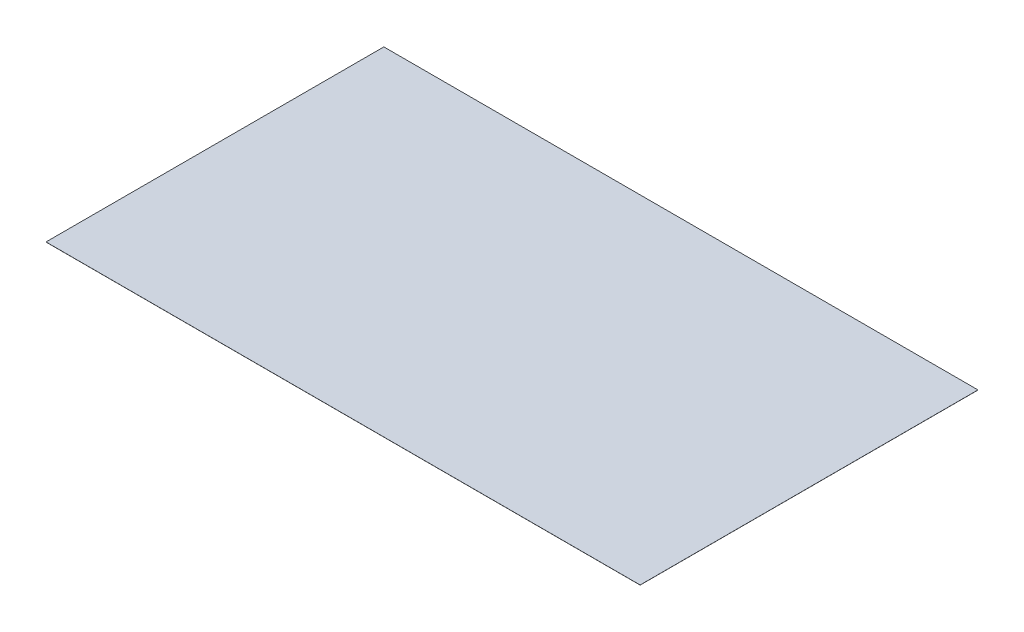
ISO-10303-21;
HEADER;
FILE_DESCRIPTION(('STEP AP214'),'2;1');
FILE_NAME('part.step','',(''),(''),'','','');
FILE_SCHEMA(('AUTOMOTIVE_DESIGN { 1 0 10303 214 1 1 1 1 }'));
ENDSEC;
DATA;
#1=APPLICATION_CONTEXT('core data for automotive mechanical design processes');
#2=APPLICATION_PROTOCOL_DEFINITION('international standard','automotive_design',2000,#1);
#3=PRODUCT_CONTEXT('',#1,'mechanical');
#4=PRODUCT('Part','Part','',(#3));
#5=PRODUCT_RELATED_PRODUCT_CATEGORY('part','',(#4));
#6=PRODUCT_DEFINITION_FORMATION('','',#4);
#7=PRODUCT_DEFINITION_CONTEXT('part definition',#1,'design');
#8=PRODUCT_DEFINITION('design','',#6,#7);
#9=PRODUCT_DEFINITION_SHAPE('','',#8);
#10=(LENGTH_UNIT() NAMED_UNIT(*) SI_UNIT(.MILLI.,.METRE.));
#11=(NAMED_UNIT(*) PLANE_ANGLE_UNIT() SI_UNIT($,.RADIAN.));
#12=(NAMED_UNIT(*) SI_UNIT($,.STERADIAN.) SOLID_ANGLE_UNIT());
#13=UNCERTAINTY_MEASURE_WITH_UNIT(LENGTH_MEASURE(1.E-05),#10,'distance_accuracy_value','');
#14=(GEOMETRIC_REPRESENTATION_CONTEXT(3) GLOBAL_UNCERTAINTY_ASSIGNED_CONTEXT((#13)) GLOBAL_UNIT_ASSIGNED_CONTEXT((#10,
#11,#12)) REPRESENTATION_CONTEXT('',''));
#15=CARTESIAN_POINT('',(0.,0.,0.));
#16=DIRECTION('',(0.,0.,1.));
#17=DIRECTION('',(1.,0.,0.));
#18=AXIS2_PLACEMENT_3D('',#15,#16,#17);
#19=CARTESIAN_POINT('',(0.,1.,0.));
#20=DIRECTION('',(-1.,0.,0.));
#21=DIRECTION('',(0.,0.,1.));
#22=AXIS2_PLACEMENT_3D('',#19,#20,#21);
#23=PLANE('',#22);
#24=DIRECTION('',(0.,0.,-1.));
#25=VECTOR('',#24,1.);
#26=CARTESIAN_POINT('',(0.,0.,0.));
#27=LINE('',#26,#25);
#28=CARTESIAN_POINT('',(3.55147571752732E-13,0.,2900.));
#29=VERTEX_POINT('',#28);
#30=CARTESIAN_POINT('',(0.,0.,0.));
#31=VERTEX_POINT('',#30);
#32=EDGE_CURVE('E98',#29,#31,#27,.T.);
#33=ORIENTED_EDGE('',*,*,#32,.T.);
#34=DIRECTION('',(0.,-1.,0.));
#35=VECTOR('',#34,1.);
#36=CARTESIAN_POINT('',(0.,1.,0.));
#37=LINE('',#36,#35);
#38=CARTESIAN_POINT('',(0.,1.,0.));
#39=VERTEX_POINT('',#38);
#40=EDGE_CURVE('E11',#39,#31,#37,.T.);
#41=ORIENTED_EDGE('',*,*,#40,.F.);
#42=DIRECTION('',(0.,0.,-1.));
#43=VECTOR('',#42,1.);
#44=CARTESIAN_POINT('',(0.,1.,0.));
#45=LINE('',#44,#43);
#46=CARTESIAN_POINT('',(3.55147571752732E-13,1.,2900.));
#47=VERTEX_POINT('',#46);
#48=EDGE_CURVE('E86',#47,#39,#45,.T.);
#49=ORIENTED_EDGE('',*,*,#48,.F.);
#50=DIRECTION('',(0.,-1.,0.));
#51=VECTOR('',#50,1.);
#52=CARTESIAN_POINT('',(3.55147571752732E-13,1.,2900.));
#53=LINE('',#52,#51);
#54=EDGE_CURVE('E94',#47,#29,#53,.T.);
#55=ORIENTED_EDGE('',*,*,#54,.T.);
#56=EDGE_LOOP('',(#33,#41,#49,#55));
#57=FACE_BOUND('',#56,.T.);
#58=ADVANCED_FACE('F35',(#57),#23,.F.);
#59=CARTESIAN_POINT('',(0.,1.,0.));
#60=DIRECTION('',(0.,0.,1.));
#61=DIRECTION('',(1.,0.,0.));
#62=AXIS2_PLACEMENT_3D('',#59,#60,#61);
#63=PLANE('',#62);
#64=DIRECTION('',(-1.,0.,0.));
#65=VECTOR('',#64,1.);
#66=CARTESIAN_POINT('',(0.,0.,0.));
#67=LINE('',#66,#65);
#68=CARTESIAN_POINT('',(-5100.,0.,6.2456986756515E-13));
#69=VERTEX_POINT('',#68);
#70=EDGE_CURVE('E90',#31,#69,#67,.T.);
#71=ORIENTED_EDGE('',*,*,#70,.T.);
#72=DIRECTION('',(0.,-1.,0.));
#73=VECTOR('',#72,1.);
#74=CARTESIAN_POINT('',(-5100.,1.,6.2456986756515E-13));
#75=LINE('',#74,#73);
#76=CARTESIAN_POINT('',(-5100.,1.,6.2456986756515E-13));
#77=VERTEX_POINT('',#76);
#78=EDGE_CURVE('E43',#77,#69,#75,.T.);
#79=ORIENTED_EDGE('',*,*,#78,.F.);
#80=DIRECTION('',(-1.,0.,0.));
#81=VECTOR('',#80,1.);
#82=CARTESIAN_POINT('',(0.,1.,0.));
#83=LINE('',#82,#81);
#84=EDGE_CURVE('E81',#39,#77,#83,.T.);
#85=ORIENTED_EDGE('',*,*,#84,.F.);
#86=ORIENTED_EDGE('',*,*,#40,.T.);
#87=EDGE_LOOP('',(#71,#79,#85,#86));
#88=FACE_BOUND('',#87,.T.);
#89=ADVANCED_FACE('F89',(#88),#63,.F.);
#90=CARTESIAN_POINT('',(-5100.,1.,6.2456986756515E-13));
#91=DIRECTION('',(1.,0.,0.));
#92=DIRECTION('',(0.,0.,-1.));
#93=AXIS2_PLACEMENT_3D('',#90,#91,#92);
#94=PLANE('',#93);
#95=DIRECTION('',(0.,0.,1.));
#96=VECTOR('',#95,1.);
#97=CARTESIAN_POINT('',(-5100.,0.,6.2456986756515E-13));
#98=LINE('',#97,#96);
#99=CARTESIAN_POINT('',(-5100.,0.,2900.));
#100=VERTEX_POINT('',#99);
#101=EDGE_CURVE('E68',#69,#100,#98,.T.);
#102=ORIENTED_EDGE('',*,*,#101,.T.);
#103=DIRECTION('',(0.,-1.,0.));
#104=VECTOR('',#103,1.);
#105=CARTESIAN_POINT('',(-5100.,1.,2900.));
#106=LINE('',#105,#104);
#107=CARTESIAN_POINT('',(-5100.,1.,2900.));
#108=VERTEX_POINT('',#107);
#109=EDGE_CURVE('E91',#108,#100,#106,.T.);
#110=ORIENTED_EDGE('',*,*,#109,.F.);
#111=DIRECTION('',(0.,0.,1.));
#112=VECTOR('',#111,1.);
#113=CARTESIAN_POINT('',(-5100.,1.,6.2456986756515E-13));
#114=LINE('',#113,#112);
#115=EDGE_CURVE('E84',#77,#108,#114,.T.);
#116=ORIENTED_EDGE('',*,*,#115,.F.);
#117=ORIENTED_EDGE('',*,*,#78,.T.);
#118=EDGE_LOOP('',(#102,#110,#116,#117));
#119=FACE_BOUND('',#118,.T.);
#120=ADVANCED_FACE('F92',(#119),#94,.F.);
#121=CARTESIAN_POINT('',(3.55147571752732E-13,1.,2900.));
#122=DIRECTION('',(0.,0.,-1.));
#123=DIRECTION('',(-1.,0.,0.));
#124=AXIS2_PLACEMENT_3D('',#121,#122,#123);
#125=PLANE('',#124);
#126=DIRECTION('',(1.,0.,0.));
#127=VECTOR('',#126,1.);
#128=CARTESIAN_POINT('',(3.55147571752732E-13,0.,2900.));
#129=LINE('',#128,#127);
#130=EDGE_CURVE('E74',#100,#29,#129,.T.);
#131=ORIENTED_EDGE('',*,*,#130,.T.);
#132=ORIENTED_EDGE('',*,*,#54,.F.);
#133=DIRECTION('',(1.,0.,0.));
#134=VECTOR('',#133,1.);
#135=CARTESIAN_POINT('',(3.55147571752732E-13,1.,2900.));
#136=LINE('',#135,#134);
#137=EDGE_CURVE('E51',#108,#47,#136,.T.);
#138=ORIENTED_EDGE('',*,*,#137,.F.);
#139=ORIENTED_EDGE('',*,*,#109,.T.);
#140=EDGE_LOOP('',(#131,#132,#138,#139));
#141=FACE_BOUND('',#140,.T.);
#142=ADVANCED_FACE('F105',(#141),#125,.F.);
#143=CARTESIAN_POINT('',(0.,1.,0.));
#144=DIRECTION('',(0.,-1.,0.));
#145=DIRECTION('',(0.,0.,-1.));
#146=AXIS2_PLACEMENT_3D('',#143,#144,#145);
#147=PLANE('',#146);
#148=ORIENTED_EDGE('',*,*,#48,.T.);
#149=ORIENTED_EDGE('',*,*,#84,.T.);
#150=ORIENTED_EDGE('',*,*,#115,.T.);
#151=ORIENTED_EDGE('',*,*,#137,.T.);
#152=EDGE_LOOP('',(#148,#149,#150,#151));
#153=FACE_BOUND('',#152,.T.);
#154=ADVANCED_FACE('F82',(#153),#147,.F.);
#155=CARTESIAN_POINT('',(0.,0.,0.));
#156=DIRECTION('',(0.,-1.,0.));
#157=DIRECTION('',(0.,0.,-1.));
#158=AXIS2_PLACEMENT_3D('',#155,#156,#157);
#159=PLANE('',#158);
#160=ORIENTED_EDGE('',*,*,#32,.F.);
#161=ORIENTED_EDGE('',*,*,#130,.F.);
#162=ORIENTED_EDGE('',*,*,#101,.F.);
#163=ORIENTED_EDGE('',*,*,#70,.F.);
#164=EDGE_LOOP('',(#160,#161,#162,#163));
#165=FACE_BOUND('',#164,.T.);
#166=ADVANCED_FACE('F108',(#165),#159,.T.);
#167=CLOSED_SHELL('',(#58,#89,#120,#142,#154,#166));
#168=MANIFOLD_SOLID_BREP('B2',#167);
#169=ADVANCED_BREP_SHAPE_REPRESENTATION('',(#18,#168),#14);
#170=SHAPE_DEFINITION_REPRESENTATION(#9,#169);
ENDSEC;
END-ISO-10303-21;
